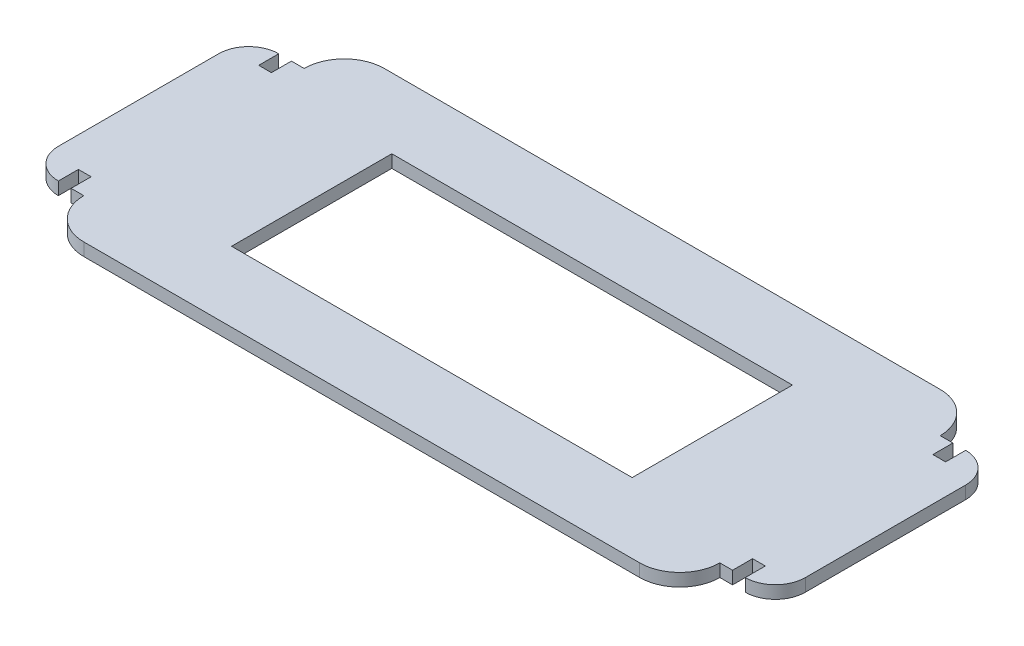
ISO-10303-21;
HEADER;
FILE_DESCRIPTION(('STEP AP214'),'2;1');
FILE_NAME('part.step','',(''),(''),'','','');
FILE_SCHEMA(('AUTOMOTIVE_DESIGN { 1 0 10303 214 1 1 1 1 }'));
ENDSEC;
DATA;
#1=APPLICATION_CONTEXT('core data for automotive mechanical design processes');
#2=APPLICATION_PROTOCOL_DEFINITION('international standard','automotive_design',2000,#1);
#3=PRODUCT_CONTEXT('',#1,'mechanical');
#4=PRODUCT('Part','Part','',(#3));
#5=PRODUCT_RELATED_PRODUCT_CATEGORY('part','',(#4));
#6=PRODUCT_DEFINITION_FORMATION('','',#4);
#7=PRODUCT_DEFINITION_CONTEXT('part definition',#1,'design');
#8=PRODUCT_DEFINITION('design','',#6,#7);
#9=PRODUCT_DEFINITION_SHAPE('','',#8);
#10=(LENGTH_UNIT() NAMED_UNIT(*) SI_UNIT(.MILLI.,.METRE.));
#11=(NAMED_UNIT(*) PLANE_ANGLE_UNIT() SI_UNIT($,.RADIAN.));
#12=(NAMED_UNIT(*) SI_UNIT($,.STERADIAN.) SOLID_ANGLE_UNIT());
#13=UNCERTAINTY_MEASURE_WITH_UNIT(LENGTH_MEASURE(1.E-05),#10,'distance_accuracy_value','');
#14=(GEOMETRIC_REPRESENTATION_CONTEXT(3) GLOBAL_UNCERTAINTY_ASSIGNED_CONTEXT((#13)) GLOBAL_UNIT_ASSIGNED_CONTEXT((#10,
#11,#12)) REPRESENTATION_CONTEXT('',''));
#15=CARTESIAN_POINT('',(0.,0.,0.));
#16=DIRECTION('',(0.,0.,1.));
#17=DIRECTION('',(1.,0.,0.));
#18=AXIS2_PLACEMENT_3D('',#15,#16,#17);
#19=CARTESIAN_POINT('',(82.55,3.175,-22.5));
#20=DIRECTION('',(0.,0.,-1.));
#21=DIRECTION('',(-1.,0.,0.));
#22=AXIS2_PLACEMENT_3D('',#19,#20,#21);
#23=PLANE('',#22);
#24=DIRECTION('',(1.,0.,0.));
#25=VECTOR('',#24,1.);
#26=CARTESIAN_POINT('',(82.55,0.,-22.5));
#27=LINE('',#26,#25);
#28=CARTESIAN_POINT('',(82.55,0.,-22.5));
#29=VERTEX_POINT('',#28);
#30=CARTESIAN_POINT('',(85.725,0.,-22.5));
#31=VERTEX_POINT('',#30);
#32=EDGE_CURVE('E372',#29,#31,#27,.T.);
#33=ORIENTED_EDGE('',*,*,#32,.F.);
#34=DIRECTION('',(0.,-1.,0.));
#35=VECTOR('',#34,1.);
#36=CARTESIAN_POINT('',(82.55,3.175,-22.5));
#37=LINE('',#36,#35);
#38=CARTESIAN_POINT('',(82.55,3.175,-22.5));
#39=VERTEX_POINT('',#38);
#40=EDGE_CURVE('E12',#39,#29,#37,.T.);
#41=ORIENTED_EDGE('',*,*,#40,.F.);
#42=DIRECTION('',(1.,0.,0.));
#43=VECTOR('',#42,1.);
#44=CARTESIAN_POINT('',(82.55,3.175,-22.5));
#45=LINE('',#44,#43);
#46=CARTESIAN_POINT('',(85.725,3.175,-22.5));
#47=VERTEX_POINT('',#46);
#48=EDGE_CURVE('E376',#39,#47,#45,.T.);
#49=ORIENTED_EDGE('',*,*,#48,.T.);
#50=DIRECTION('',(0.,-1.,0.));
#51=VECTOR('',#50,1.);
#52=CARTESIAN_POINT('',(85.725,3.175,-22.5));
#53=LINE('',#52,#51);
#54=EDGE_CURVE('E133',#47,#31,#53,.T.);
#55=ORIENTED_EDGE('',*,*,#54,.T.);
#56=EDGE_LOOP('',(#33,#41,#49,#55));
#57=FACE_BOUND('',#56,.T.);
#58=ADVANCED_FACE('F130',(#57),#23,.T.);
#59=CARTESIAN_POINT('',(82.55,3.175,-27.5));
#60=DIRECTION('',(1.,0.,0.));
#61=DIRECTION('',(0.,0.,-1.));
#62=AXIS2_PLACEMENT_3D('',#59,#60,#61);
#63=PLANE('',#62);
#64=DIRECTION('',(0.,0.,1.));
#65=VECTOR('',#64,1.);
#66=CARTESIAN_POINT('',(82.55,0.,-27.5));
#67=LINE('',#66,#65);
#68=CARTESIAN_POINT('',(82.55,0.,-27.5));
#69=VERTEX_POINT('',#68);
#70=EDGE_CURVE('E380',#69,#29,#67,.T.);
#71=ORIENTED_EDGE('',*,*,#70,.F.);
#72=DIRECTION('',(0.,-1.,0.));
#73=VECTOR('',#72,1.);
#74=CARTESIAN_POINT('',(82.55,3.175,-27.5));
#75=LINE('',#74,#73);
#76=CARTESIAN_POINT('',(82.55,3.175,-27.5));
#77=VERTEX_POINT('',#76);
#78=EDGE_CURVE('E138',#77,#69,#75,.T.);
#79=ORIENTED_EDGE('',*,*,#78,.F.);
#80=DIRECTION('',(0.,0.,1.));
#81=VECTOR('',#80,1.);
#82=CARTESIAN_POINT('',(82.55,3.175,-27.5));
#83=LINE('',#82,#81);
#84=EDGE_CURVE('E444',#77,#39,#83,.T.);
#85=ORIENTED_EDGE('',*,*,#84,.T.);
#86=ORIENTED_EDGE('',*,*,#40,.T.);
#87=EDGE_LOOP('',(#71,#79,#85,#86));
#88=FACE_BOUND('',#87,.T.);
#89=ADVANCED_FACE('F592',(#88),#63,.T.);
#90=CARTESIAN_POINT('',(79.375,3.175,-27.5));
#91=DIRECTION('',(0.,0.,-1.));
#92=DIRECTION('',(-1.,0.,0.));
#93=AXIS2_PLACEMENT_3D('',#90,#91,#92);
#94=PLANE('',#93);
#95=DIRECTION('',(1.,0.,0.));
#96=VECTOR('',#95,1.);
#97=CARTESIAN_POINT('',(79.375,0.,-27.5));
#98=LINE('',#97,#96);
#99=CARTESIAN_POINT('',(79.375,0.,-27.5));
#100=VERTEX_POINT('',#99);
#101=EDGE_CURVE('E514',#100,#69,#98,.T.);
#102=ORIENTED_EDGE('',*,*,#101,.F.);
#103=DIRECTION('',(0.,-1.,0.));
#104=VECTOR('',#103,1.);
#105=CARTESIAN_POINT('',(79.375,3.175,-27.5));
#106=LINE('',#105,#104);
#107=CARTESIAN_POINT('',(79.375,3.175,-27.5));
#108=VERTEX_POINT('',#107);
#109=EDGE_CURVE('E520',#108,#100,#106,.T.);
#110=ORIENTED_EDGE('',*,*,#109,.F.);
#111=DIRECTION('',(1.,0.,0.));
#112=VECTOR('',#111,1.);
#113=CARTESIAN_POINT('',(79.375,3.175,-27.5));
#114=LINE('',#113,#112);
#115=EDGE_CURVE('E441',#108,#77,#114,.T.);
#116=ORIENTED_EDGE('',*,*,#115,.T.);
#117=ORIENTED_EDGE('',*,*,#78,.T.);
#118=EDGE_LOOP('',(#102,#110,#116,#117));
#119=FACE_BOUND('',#118,.T.);
#120=ADVANCED_FACE('F701',(#119),#94,.T.);
#121=CARTESIAN_POINT('',(69.375,3.175,-27.5));
#122=DIRECTION('',(0.,-1.,0.));
#123=DIRECTION('',(0.,0.,-1.));
#124=AXIS2_PLACEMENT_3D('',#121,#122,#123);
#125=CYLINDRICAL_SURFACE('',#124,9.99999999999999);
#126=CARTESIAN_POINT('',(69.375,0.,-27.5));
#127=DIRECTION('',(0.,1.,0.));
#128=DIRECTION('',(0.,0.,1.));
#129=AXIS2_PLACEMENT_3D('',#126,#127,#128);
#130=CIRCLE('',#129,9.99999999999999);
#131=CARTESIAN_POINT('',(69.375,0.,-37.5));
#132=VERTEX_POINT('',#131);
#133=EDGE_CURVE('E511',#100,#132,#130,.T.);
#134=ORIENTED_EDGE('',*,*,#133,.T.);
#135=DIRECTION('',(0.,-1.,0.));
#136=VECTOR('',#135,1.);
#137=CARTESIAN_POINT('',(69.375,3.175,-37.5));
#138=LINE('',#137,#136);
#139=CARTESIAN_POINT('',(69.375,3.175,-37.5));
#140=VERTEX_POINT('',#139);
#141=EDGE_CURVE('E522',#140,#132,#138,.T.);
#142=ORIENTED_EDGE('',*,*,#141,.F.);
#143=CARTESIAN_POINT('',(69.375,3.175,-27.5));
#144=DIRECTION('',(0.,1.,0.));
#145=DIRECTION('',(0.,0.,1.));
#146=AXIS2_PLACEMENT_3D('',#143,#144,#145);
#147=CIRCLE('',#146,9.99999999999999);
#148=EDGE_CURVE('E439',#108,#140,#147,.T.);
#149=ORIENTED_EDGE('',*,*,#148,.F.);
#150=ORIENTED_EDGE('',*,*,#109,.T.);
#151=EDGE_LOOP('',(#134,#142,#149,#150));
#152=FACE_BOUND('',#151,.T.);
#153=ADVANCED_FACE('F703',(#152),#125,.T.);
#154=CARTESIAN_POINT('',(-69.375,3.175,-37.5));
#155=DIRECTION('',(0.,0.,-1.));
#156=DIRECTION('',(-1.,0.,0.));
#157=AXIS2_PLACEMENT_3D('',#154,#155,#156);
#158=PLANE('',#157);
#159=DIRECTION('',(1.,0.,0.));
#160=VECTOR('',#159,1.);
#161=CARTESIAN_POINT('',(-69.375,0.,-37.5));
#162=LINE('',#161,#160);
#163=CARTESIAN_POINT('',(-69.375,0.,-37.5));
#164=VERTEX_POINT('',#163);
#165=EDGE_CURVE('E508',#164,#132,#162,.T.);
#166=ORIENTED_EDGE('',*,*,#165,.F.);
#167=DIRECTION('',(0.,-1.,0.));
#168=VECTOR('',#167,1.);
#169=CARTESIAN_POINT('',(-69.375,3.175,-37.5));
#170=LINE('',#169,#168);
#171=CARTESIAN_POINT('',(-69.375,3.175,-37.5));
#172=VERTEX_POINT('',#171);
#173=EDGE_CURVE('E524',#172,#164,#170,.T.);
#174=ORIENTED_EDGE('',*,*,#173,.F.);
#175=DIRECTION('',(1.,0.,0.));
#176=VECTOR('',#175,1.);
#177=CARTESIAN_POINT('',(-69.375,3.175,-37.5));
#178=LINE('',#177,#176);
#179=EDGE_CURVE('E436',#172,#140,#178,.T.);
#180=ORIENTED_EDGE('',*,*,#179,.T.);
#181=ORIENTED_EDGE('',*,*,#141,.T.);
#182=EDGE_LOOP('',(#166,#174,#180,#181));
#183=FACE_BOUND('',#182,.T.);
#184=ADVANCED_FACE('F697',(#183),#158,.T.);
#185=CARTESIAN_POINT('',(-69.375,3.175,-27.5));
#186=DIRECTION('',(0.,-1.,0.));
#187=DIRECTION('',(0.,0.,-1.));
#188=AXIS2_PLACEMENT_3D('',#185,#186,#187);
#189=CYLINDRICAL_SURFACE('',#188,9.99999999999999);
#190=CARTESIAN_POINT('',(-69.375,0.,-27.5));
#191=DIRECTION('',(0.,-1.,0.));
#192=DIRECTION('',(0.,0.,-1.));
#193=AXIS2_PLACEMENT_3D('',#190,#191,#192);
#194=CIRCLE('',#193,9.99999999999999);
#195=CARTESIAN_POINT('',(-79.375,0.,-27.5));
#196=VERTEX_POINT('',#195);
#197=EDGE_CURVE('E505',#196,#164,#194,.T.);
#198=ORIENTED_EDGE('',*,*,#197,.F.);
#199=DIRECTION('',(0.,-1.,0.));
#200=VECTOR('',#199,1.);
#201=CARTESIAN_POINT('',(-79.375,3.175,-27.5));
#202=LINE('',#201,#200);
#203=CARTESIAN_POINT('',(-79.375,3.175,-27.5));
#204=VERTEX_POINT('',#203);
#205=EDGE_CURVE('E526',#204,#196,#202,.T.);
#206=ORIENTED_EDGE('',*,*,#205,.F.);
#207=CARTESIAN_POINT('',(-69.375,3.175,-27.5));
#208=DIRECTION('',(0.,-1.,0.));
#209=DIRECTION('',(0.,0.,-1.));
#210=AXIS2_PLACEMENT_3D('',#207,#208,#209);
#211=CIRCLE('',#210,9.99999999999999);
#212=EDGE_CURVE('E433',#204,#172,#211,.T.);
#213=ORIENTED_EDGE('',*,*,#212,.T.);
#214=ORIENTED_EDGE('',*,*,#173,.T.);
#215=EDGE_LOOP('',(#198,#206,#213,#214));
#216=FACE_BOUND('',#215,.T.);
#217=ADVANCED_FACE('F693',(#216),#189,.T.);
#218=CARTESIAN_POINT('',(-79.375,3.175,-27.5));
#219=DIRECTION('',(0.,0.,1.));
#220=DIRECTION('',(1.,0.,0.));
#221=AXIS2_PLACEMENT_3D('',#218,#219,#220);
#222=PLANE('',#221);
#223=DIRECTION('',(-1.,0.,0.));
#224=VECTOR('',#223,1.);
#225=CARTESIAN_POINT('',(-79.375,0.,-27.5));
#226=LINE('',#225,#224);
#227=CARTESIAN_POINT('',(-82.55,0.,-27.5));
#228=VERTEX_POINT('',#227);
#229=EDGE_CURVE('E503',#196,#228,#226,.T.);
#230=ORIENTED_EDGE('',*,*,#229,.T.);
#231=DIRECTION('',(0.,-1.,0.));
#232=VECTOR('',#231,1.);
#233=CARTESIAN_POINT('',(-82.55,3.175,-27.5));
#234=LINE('',#233,#232);
#235=CARTESIAN_POINT('',(-82.55,3.175,-27.5));
#236=VERTEX_POINT('',#235);
#237=EDGE_CURVE('E528',#236,#228,#234,.T.);
#238=ORIENTED_EDGE('',*,*,#237,.F.);
#239=DIRECTION('',(-1.,0.,0.));
#240=VECTOR('',#239,1.);
#241=CARTESIAN_POINT('',(-79.375,3.175,-27.5));
#242=LINE('',#241,#240);
#243=EDGE_CURVE('E431',#204,#236,#242,.T.);
#244=ORIENTED_EDGE('',*,*,#243,.F.);
#245=ORIENTED_EDGE('',*,*,#205,.T.);
#246=EDGE_LOOP('',(#230,#238,#244,#245));
#247=FACE_BOUND('',#246,.T.);
#248=ADVANCED_FACE('F689',(#247),#222,.F.);
#249=CARTESIAN_POINT('',(-82.55,3.175,-27.5));
#250=DIRECTION('',(1.,0.,0.));
#251=DIRECTION('',(0.,0.,-1.));
#252=AXIS2_PLACEMENT_3D('',#249,#250,#251);
#253=PLANE('',#252);
#254=DIRECTION('',(0.,0.,1.));
#255=VECTOR('',#254,1.);
#256=CARTESIAN_POINT('',(-82.55,0.,-27.5));
#257=LINE('',#256,#255);
#258=CARTESIAN_POINT('',(-82.55,0.,-22.5));
#259=VERTEX_POINT('',#258);
#260=EDGE_CURVE('E501',#228,#259,#257,.T.);
#261=ORIENTED_EDGE('',*,*,#260,.T.);
#262=DIRECTION('',(0.,-1.,0.));
#263=VECTOR('',#262,1.);
#264=CARTESIAN_POINT('',(-82.55,3.175,-22.5));
#265=LINE('',#264,#263);
#266=CARTESIAN_POINT('',(-82.55,3.175,-22.5));
#267=VERTEX_POINT('',#266);
#268=EDGE_CURVE('E531',#267,#259,#265,.T.);
#269=ORIENTED_EDGE('',*,*,#268,.F.);
#270=DIRECTION('',(0.,0.,1.));
#271=VECTOR('',#270,1.);
#272=CARTESIAN_POINT('',(-82.55,3.175,-27.5));
#273=LINE('',#272,#271);
#274=EDGE_CURVE('E429',#236,#267,#273,.T.);
#275=ORIENTED_EDGE('',*,*,#274,.F.);
#276=ORIENTED_EDGE('',*,*,#237,.T.);
#277=EDGE_LOOP('',(#261,#269,#275,#276));
#278=FACE_BOUND('',#277,.T.);
#279=ADVANCED_FACE('F685',(#278),#253,.F.);
#280=CARTESIAN_POINT('',(-82.55,3.175,-22.5));
#281=DIRECTION('',(0.,0.,1.));
#282=DIRECTION('',(1.,0.,0.));
#283=AXIS2_PLACEMENT_3D('',#280,#281,#282);
#284=PLANE('',#283);
#285=DIRECTION('',(-1.,0.,0.));
#286=VECTOR('',#285,1.);
#287=CARTESIAN_POINT('',(-82.55,0.,-22.5));
#288=LINE('',#287,#286);
#289=CARTESIAN_POINT('',(-85.725,0.,-22.5));
#290=VERTEX_POINT('',#289);
#291=EDGE_CURVE('E499',#259,#290,#288,.T.);
#292=ORIENTED_EDGE('',*,*,#291,.T.);
#293=DIRECTION('',(0.,-1.,0.));
#294=VECTOR('',#293,1.);
#295=CARTESIAN_POINT('',(-85.725,3.175,-22.5));
#296=LINE('',#295,#294);
#297=CARTESIAN_POINT('',(-85.725,3.175,-22.5));
#298=VERTEX_POINT('',#297);
#299=EDGE_CURVE('E534',#298,#290,#296,.T.);
#300=ORIENTED_EDGE('',*,*,#299,.F.);
#301=DIRECTION('',(-1.,0.,0.));
#302=VECTOR('',#301,1.);
#303=CARTESIAN_POINT('',(-82.55,3.175,-22.5));
#304=LINE('',#303,#302);
#305=EDGE_CURVE('E427',#267,#298,#304,.T.);
#306=ORIENTED_EDGE('',*,*,#305,.F.);
#307=ORIENTED_EDGE('',*,*,#268,.T.);
#308=EDGE_LOOP('',(#292,#300,#306,#307));
#309=FACE_BOUND('',#308,.T.);
#310=ADVANCED_FACE('F680',(#309),#284,.F.);
#311=CARTESIAN_POINT('',(-85.725,3.175,-22.5));
#312=DIRECTION('',(-1.,0.,0.));
#313=DIRECTION('',(0.,0.,1.));
#314=AXIS2_PLACEMENT_3D('',#311,#312,#313);
#315=PLANE('',#314);
#316=DIRECTION('',(0.,0.,-1.));
#317=VECTOR('',#316,1.);
#318=CARTESIAN_POINT('',(-85.725,0.,-22.5));
#319=LINE('',#318,#317);
#320=CARTESIAN_POINT('',(-85.725,0.,-27.5));
#321=VERTEX_POINT('',#320);
#322=EDGE_CURVE('E497',#290,#321,#319,.T.);
#323=ORIENTED_EDGE('',*,*,#322,.T.);
#324=DIRECTION('',(0.,-1.,0.));
#325=VECTOR('',#324,1.);
#326=CARTESIAN_POINT('',(-85.725,3.175,-27.5));
#327=LINE('',#326,#325);
#328=CARTESIAN_POINT('',(-85.725,3.175,-27.5));
#329=VERTEX_POINT('',#328);
#330=EDGE_CURVE('E537',#329,#321,#327,.T.);
#331=ORIENTED_EDGE('',*,*,#330,.F.);
#332=DIRECTION('',(0.,0.,-1.));
#333=VECTOR('',#332,1.);
#334=CARTESIAN_POINT('',(-85.725,3.175,-22.5));
#335=LINE('',#334,#333);
#336=EDGE_CURVE('E425',#298,#329,#335,.T.);
#337=ORIENTED_EDGE('',*,*,#336,.F.);
#338=ORIENTED_EDGE('',*,*,#299,.T.);
#339=EDGE_LOOP('',(#323,#331,#337,#338));
#340=FACE_BOUND('',#339,.T.);
#341=ADVANCED_FACE('F674',(#340),#315,.F.);
#342=CARTESIAN_POINT('',(-85.725,3.175,-20.));
#343=DIRECTION('',(0.,-1.,0.));
#344=DIRECTION('',(0.,0.,-1.));
#345=AXIS2_PLACEMENT_3D('',#342,#343,#344);
#346=CYLINDRICAL_SURFACE('',#345,7.5);
#347=CARTESIAN_POINT('',(-85.725,0.,-20.));
#348=DIRECTION('',(0.,1.,0.));
#349=DIRECTION('',(0.,0.,1.));
#350=AXIS2_PLACEMENT_3D('',#347,#348,#349);
#351=CIRCLE('',#350,7.5);
#352=CARTESIAN_POINT('',(-93.225,0.,-20.));
#353=VERTEX_POINT('',#352);
#354=EDGE_CURVE('E494',#321,#353,#351,.T.);
#355=ORIENTED_EDGE('',*,*,#354,.T.);
#356=DIRECTION('',(0.,-1.,0.));
#357=VECTOR('',#356,1.);
#358=CARTESIAN_POINT('',(-93.225,3.175,-20.));
#359=LINE('',#358,#357);
#360=CARTESIAN_POINT('',(-93.225,3.175,-20.));
#361=VERTEX_POINT('',#360);
#362=EDGE_CURVE('E540',#361,#353,#359,.T.);
#363=ORIENTED_EDGE('',*,*,#362,.F.);
#364=CARTESIAN_POINT('',(-85.725,3.175,-20.));
#365=DIRECTION('',(0.,1.,0.));
#366=DIRECTION('',(0.,0.,1.));
#367=AXIS2_PLACEMENT_3D('',#364,#365,#366);
#368=CIRCLE('',#367,7.5);
#369=EDGE_CURVE('E423',#329,#361,#368,.T.);
#370=ORIENTED_EDGE('',*,*,#369,.F.);
#371=ORIENTED_EDGE('',*,*,#330,.T.);
#372=EDGE_LOOP('',(#355,#363,#370,#371));
#373=FACE_BOUND('',#372,.T.);
#374=ADVANCED_FACE('F670',(#373),#346,.T.);
#375=CARTESIAN_POINT('',(-93.225,3.175,20.));
#376=DIRECTION('',(-1.,0.,0.));
#377=DIRECTION('',(0.,0.,1.));
#378=AXIS2_PLACEMENT_3D('',#375,#376,#377);
#379=PLANE('',#378);
#380=DIRECTION('',(0.,0.,-1.));
#381=VECTOR('',#380,1.);
#382=CARTESIAN_POINT('',(-93.225,0.,20.));
#383=LINE('',#382,#381);
#384=CARTESIAN_POINT('',(-93.225,0.,20.));
#385=VERTEX_POINT('',#384);
#386=EDGE_CURVE('E491',#385,#353,#383,.T.);
#387=ORIENTED_EDGE('',*,*,#386,.F.);
#388=DIRECTION('',(0.,-1.,0.));
#389=VECTOR('',#388,1.);
#390=CARTESIAN_POINT('',(-93.225,3.175,20.));
#391=LINE('',#390,#389);
#392=CARTESIAN_POINT('',(-93.225,3.175,20.));
#393=VERTEX_POINT('',#392);
#394=EDGE_CURVE('E542',#393,#385,#391,.T.);
#395=ORIENTED_EDGE('',*,*,#394,.F.);
#396=DIRECTION('',(0.,0.,-1.));
#397=VECTOR('',#396,1.);
#398=CARTESIAN_POINT('',(-93.225,3.175,20.));
#399=LINE('',#398,#397);
#400=EDGE_CURVE('E420',#393,#361,#399,.T.);
#401=ORIENTED_EDGE('',*,*,#400,.T.);
#402=ORIENTED_EDGE('',*,*,#362,.T.);
#403=EDGE_LOOP('',(#387,#395,#401,#402));
#404=FACE_BOUND('',#403,.T.);
#405=ADVANCED_FACE('F665',(#404),#379,.T.);
#406=CARTESIAN_POINT('',(-85.725,3.175,20.));
#407=DIRECTION('',(0.,-1.,0.));
#408=DIRECTION('',(0.,0.,-1.));
#409=AXIS2_PLACEMENT_3D('',#406,#407,#408);
#410=CYLINDRICAL_SURFACE('',#409,7.5);
#411=CARTESIAN_POINT('',(-85.725,0.,20.));
#412=DIRECTION('',(0.,-1.,0.));
#413=DIRECTION('',(0.,0.,-1.));
#414=AXIS2_PLACEMENT_3D('',#411,#412,#413);
#415=CIRCLE('',#414,7.5);
#416=CARTESIAN_POINT('',(-85.725,0.,27.5));
#417=VERTEX_POINT('',#416);
#418=EDGE_CURVE('E488',#417,#385,#415,.T.);
#419=ORIENTED_EDGE('',*,*,#418,.F.);
#420=DIRECTION('',(0.,-1.,0.));
#421=VECTOR('',#420,1.);
#422=CARTESIAN_POINT('',(-85.725,3.175,27.5));
#423=LINE('',#422,#421);
#424=CARTESIAN_POINT('',(-85.725,3.175,27.5));
#425=VERTEX_POINT('',#424);
#426=EDGE_CURVE('E544',#425,#417,#423,.T.);
#427=ORIENTED_EDGE('',*,*,#426,.F.);
#428=CARTESIAN_POINT('',(-85.725,3.175,20.));
#429=DIRECTION('',(0.,-1.,0.));
#430=DIRECTION('',(0.,0.,-1.));
#431=AXIS2_PLACEMENT_3D('',#428,#429,#430);
#432=CIRCLE('',#431,7.5);
#433=EDGE_CURVE('E417',#425,#393,#432,.T.);
#434=ORIENTED_EDGE('',*,*,#433,.T.);
#435=ORIENTED_EDGE('',*,*,#394,.T.);
#436=EDGE_LOOP('',(#419,#427,#434,#435));
#437=FACE_BOUND('',#436,.T.);
#438=ADVANCED_FACE('F660',(#437),#410,.T.);
#439=CARTESIAN_POINT('',(-85.725,3.175,22.5));
#440=DIRECTION('',(1.,0.,0.));
#441=DIRECTION('',(0.,0.,-1.));
#442=AXIS2_PLACEMENT_3D('',#439,#440,#441);
#443=PLANE('',#442);
#444=DIRECTION('',(0.,0.,1.));
#445=VECTOR('',#444,1.);
#446=CARTESIAN_POINT('',(-85.725,0.,22.5));
#447=LINE('',#446,#445);
#448=CARTESIAN_POINT('',(-85.725,0.,22.5));
#449=VERTEX_POINT('',#448);
#450=EDGE_CURVE('E485',#449,#417,#447,.T.);
#451=ORIENTED_EDGE('',*,*,#450,.F.);
#452=DIRECTION('',(0.,-1.,0.));
#453=VECTOR('',#452,1.);
#454=CARTESIAN_POINT('',(-85.725,3.175,22.5));
#455=LINE('',#454,#453);
#456=CARTESIAN_POINT('',(-85.725,3.175,22.5));
#457=VERTEX_POINT('',#456);
#458=EDGE_CURVE('E546',#457,#449,#455,.T.);
#459=ORIENTED_EDGE('',*,*,#458,.F.);
#460=DIRECTION('',(0.,0.,1.));
#461=VECTOR('',#460,1.);
#462=CARTESIAN_POINT('',(-85.725,3.175,22.5));
#463=LINE('',#462,#461);
#464=EDGE_CURVE('E414',#457,#425,#463,.T.);
#465=ORIENTED_EDGE('',*,*,#464,.T.);
#466=ORIENTED_EDGE('',*,*,#426,.T.);
#467=EDGE_LOOP('',(#451,#459,#465,#466));
#468=FACE_BOUND('',#467,.T.);
#469=ADVANCED_FACE('F656',(#468),#443,.T.);
#470=CARTESIAN_POINT('',(-82.55,3.175,22.5));
#471=DIRECTION('',(0.,0.,1.));
#472=DIRECTION('',(1.,0.,0.));
#473=AXIS2_PLACEMENT_3D('',#470,#471,#472);
#474=PLANE('',#473);
#475=DIRECTION('',(-1.,0.,0.));
#476=VECTOR('',#475,1.);
#477=CARTESIAN_POINT('',(-82.55,0.,22.5));
#478=LINE('',#477,#476);
#479=CARTESIAN_POINT('',(-82.55,0.,22.5));
#480=VERTEX_POINT('',#479);
#481=EDGE_CURVE('E482',#480,#449,#478,.T.);
#482=ORIENTED_EDGE('',*,*,#481,.F.);
#483=DIRECTION('',(0.,-1.,0.));
#484=VECTOR('',#483,1.);
#485=CARTESIAN_POINT('',(-82.55,3.175,22.5));
#486=LINE('',#485,#484);
#487=CARTESIAN_POINT('',(-82.55,3.175,22.5));
#488=VERTEX_POINT('',#487);
#489=EDGE_CURVE('E548',#488,#480,#486,.T.);
#490=ORIENTED_EDGE('',*,*,#489,.F.);
#491=DIRECTION('',(-1.,0.,0.));
#492=VECTOR('',#491,1.);
#493=CARTESIAN_POINT('',(-82.55,3.175,22.5));
#494=LINE('',#493,#492);
#495=EDGE_CURVE('E411',#488,#457,#494,.T.);
#496=ORIENTED_EDGE('',*,*,#495,.T.);
#497=ORIENTED_EDGE('',*,*,#458,.T.);
#498=EDGE_LOOP('',(#482,#490,#496,#497));
#499=FACE_BOUND('',#498,.T.);
#500=ADVANCED_FACE('F652',(#499),#474,.T.);
#501=CARTESIAN_POINT('',(-82.55,3.175,27.5));
#502=DIRECTION('',(-1.,0.,0.));
#503=DIRECTION('',(0.,0.,1.));
#504=AXIS2_PLACEMENT_3D('',#501,#502,#503);
#505=PLANE('',#504);
#506=DIRECTION('',(0.,0.,-1.));
#507=VECTOR('',#506,1.);
#508=CARTESIAN_POINT('',(-82.55,0.,27.5));
#509=LINE('',#508,#507);
#510=CARTESIAN_POINT('',(-82.55,0.,27.5));
#511=VERTEX_POINT('',#510);
#512=EDGE_CURVE('E479',#511,#480,#509,.T.);
#513=ORIENTED_EDGE('',*,*,#512,.F.);
#514=DIRECTION('',(0.,-1.,0.));
#515=VECTOR('',#514,1.);
#516=CARTESIAN_POINT('',(-82.55,3.175,27.5));
#517=LINE('',#516,#515);
#518=CARTESIAN_POINT('',(-82.55,3.175,27.5));
#519=VERTEX_POINT('',#518);
#520=EDGE_CURVE('E550',#519,#511,#517,.T.);
#521=ORIENTED_EDGE('',*,*,#520,.F.);
#522=DIRECTION('',(0.,0.,-1.));
#523=VECTOR('',#522,1.);
#524=CARTESIAN_POINT('',(-82.55,3.175,27.5));
#525=LINE('',#524,#523);
#526=EDGE_CURVE('E408',#519,#488,#525,.T.);
#527=ORIENTED_EDGE('',*,*,#526,.T.);
#528=ORIENTED_EDGE('',*,*,#489,.T.);
#529=EDGE_LOOP('',(#513,#521,#527,#528));
#530=FACE_BOUND('',#529,.T.);
#531=ADVANCED_FACE('F648',(#530),#505,.T.);
#532=CARTESIAN_POINT('',(-79.375,3.175,27.5));
#533=DIRECTION('',(0.,0.,1.));
#534=DIRECTION('',(1.,0.,0.));
#535=AXIS2_PLACEMENT_3D('',#532,#533,#534);
#536=PLANE('',#535);
#537=DIRECTION('',(-1.,0.,0.));
#538=VECTOR('',#537,1.);
#539=CARTESIAN_POINT('',(-79.375,0.,27.5));
#540=LINE('',#539,#538);
#541=CARTESIAN_POINT('',(-79.375,0.,27.5));
#542=VERTEX_POINT('',#541);
#543=EDGE_CURVE('E476',#542,#511,#540,.T.);
#544=ORIENTED_EDGE('',*,*,#543,.F.);
#545=DIRECTION('',(0.,-1.,0.));
#546=VECTOR('',#545,1.);
#547=CARTESIAN_POINT('',(-79.375,3.175,27.5));
#548=LINE('',#547,#546);
#549=CARTESIAN_POINT('',(-79.375,3.175,27.5));
#550=VERTEX_POINT('',#549);
#551=EDGE_CURVE('E552',#550,#542,#548,.T.);
#552=ORIENTED_EDGE('',*,*,#551,.F.);
#553=DIRECTION('',(-1.,0.,0.));
#554=VECTOR('',#553,1.);
#555=CARTESIAN_POINT('',(-79.375,3.175,27.5));
#556=LINE('',#555,#554);
#557=EDGE_CURVE('E405',#550,#519,#556,.T.);
#558=ORIENTED_EDGE('',*,*,#557,.T.);
#559=ORIENTED_EDGE('',*,*,#520,.T.);
#560=EDGE_LOOP('',(#544,#552,#558,#559));
#561=FACE_BOUND('',#560,.T.);
#562=ADVANCED_FACE('F642',(#561),#536,.T.);
#563=CARTESIAN_POINT('',(-69.375,3.175,27.5));
#564=DIRECTION('',(0.,-1.,0.));
#565=DIRECTION('',(0.,0.,-1.));
#566=AXIS2_PLACEMENT_3D('',#563,#564,#565);
#567=CYLINDRICAL_SURFACE('',#566,9.99999999999999);
#568=CARTESIAN_POINT('',(-69.375,0.,27.5));
#569=DIRECTION('',(0.,1.,0.));
#570=DIRECTION('',(0.,0.,1.));
#571=AXIS2_PLACEMENT_3D('',#568,#569,#570);
#572=CIRCLE('',#571,9.99999999999999);
#573=CARTESIAN_POINT('',(-69.375,0.,37.5));
#574=VERTEX_POINT('',#573);
#575=EDGE_CURVE('E474',#542,#574,#572,.T.);
#576=ORIENTED_EDGE('',*,*,#575,.T.);
#577=DIRECTION('',(0.,-1.,0.));
#578=VECTOR('',#577,1.);
#579=CARTESIAN_POINT('',(-69.375,3.175,37.5));
#580=LINE('',#579,#578);
#581=CARTESIAN_POINT('',(-69.375,3.175,37.5));
#582=VERTEX_POINT('',#581);
#583=EDGE_CURVE('E554',#582,#574,#580,.T.);
#584=ORIENTED_EDGE('',*,*,#583,.F.);
#585=CARTESIAN_POINT('',(-69.375,3.175,27.5));
#586=DIRECTION('',(0.,1.,0.));
#587=DIRECTION('',(0.,0.,1.));
#588=AXIS2_PLACEMENT_3D('',#585,#586,#587);
#589=CIRCLE('',#588,9.99999999999999);
#590=EDGE_CURVE('E403',#550,#582,#589,.T.);
#591=ORIENTED_EDGE('',*,*,#590,.F.);
#592=ORIENTED_EDGE('',*,*,#551,.T.);
#593=EDGE_LOOP('',(#576,#584,#591,#592));
#594=FACE_BOUND('',#593,.T.);
#595=ADVANCED_FACE('F839',(#594),#567,.T.);
#596=CARTESIAN_POINT('',(-69.375,3.175,37.5));
#597=DIRECTION('',(0.,0.,-1.));
#598=DIRECTION('',(-1.,0.,0.));
#599=AXIS2_PLACEMENT_3D('',#596,#597,#598);
#600=PLANE('',#599);
#601=DIRECTION('',(1.,0.,0.));
#602=VECTOR('',#601,1.);
#603=CARTESIAN_POINT('',(-69.375,0.,37.5));
#604=LINE('',#603,#602);
#605=CARTESIAN_POINT('',(69.375,0.,37.5));
#606=VERTEX_POINT('',#605);
#607=EDGE_CURVE('E471',#574,#606,#604,.T.);
#608=ORIENTED_EDGE('',*,*,#607,.T.);
#609=DIRECTION('',(0.,-1.,0.));
#610=VECTOR('',#609,1.);
#611=CARTESIAN_POINT('',(69.375,3.175,37.5));
#612=LINE('',#611,#610);
#613=CARTESIAN_POINT('',(69.375,3.175,37.5));
#614=VERTEX_POINT('',#613);
#615=EDGE_CURVE('E557',#614,#606,#612,.T.);
#616=ORIENTED_EDGE('',*,*,#615,.F.);
#617=DIRECTION('',(1.,0.,0.));
#618=VECTOR('',#617,1.);
#619=CARTESIAN_POINT('',(-69.375,3.175,37.5));
#620=LINE('',#619,#618);
#621=EDGE_CURVE('E401',#582,#614,#620,.T.);
#622=ORIENTED_EDGE('',*,*,#621,.F.);
#623=ORIENTED_EDGE('',*,*,#583,.T.);
#624=EDGE_LOOP('',(#608,#616,#622,#623));
#625=FACE_BOUND('',#624,.T.);
#626=ADVANCED_FACE('F636',(#625),#600,.F.);
#627=CARTESIAN_POINT('',(69.375,3.175,27.5));
#628=DIRECTION('',(0.,-1.,0.));
#629=DIRECTION('',(0.,0.,-1.));
#630=AXIS2_PLACEMENT_3D('',#627,#628,#629);
#631=CYLINDRICAL_SURFACE('',#630,9.99999999999999);
#632=CARTESIAN_POINT('',(69.375,0.,27.5));
#633=DIRECTION('',(0.,-1.,0.));
#634=DIRECTION('',(0.,0.,-1.));
#635=AXIS2_PLACEMENT_3D('',#632,#633,#634);
#636=CIRCLE('',#635,9.99999999999999);
#637=CARTESIAN_POINT('',(79.375,0.,27.5));
#638=VERTEX_POINT('',#637);
#639=EDGE_CURVE('E468',#638,#606,#636,.T.);
#640=ORIENTED_EDGE('',*,*,#639,.F.);
#641=DIRECTION('',(0.,-1.,0.));
#642=VECTOR('',#641,1.);
#643=CARTESIAN_POINT('',(79.375,3.175,27.5));
#644=LINE('',#643,#642);
#645=CARTESIAN_POINT('',(79.375,3.175,27.5));
#646=VERTEX_POINT('',#645);
#647=EDGE_CURVE('E559',#646,#638,#644,.T.);
#648=ORIENTED_EDGE('',*,*,#647,.F.);
#649=CARTESIAN_POINT('',(69.375,3.175,27.5));
#650=DIRECTION('',(0.,-1.,0.));
#651=DIRECTION('',(0.,0.,-1.));
#652=AXIS2_PLACEMENT_3D('',#649,#650,#651);
#653=CIRCLE('',#652,9.99999999999999);
#654=EDGE_CURVE('E398',#646,#614,#653,.T.);
#655=ORIENTED_EDGE('',*,*,#654,.T.);
#656=ORIENTED_EDGE('',*,*,#615,.T.);
#657=EDGE_LOOP('',(#640,#648,#655,#656));
#658=FACE_BOUND('',#657,.T.);
#659=ADVANCED_FACE('F632',(#658),#631,.T.);
#660=CARTESIAN_POINT('',(79.375,3.175,27.5));
#661=DIRECTION('',(0.,0.,-1.));
#662=DIRECTION('',(-1.,0.,0.));
#663=AXIS2_PLACEMENT_3D('',#660,#661,#662);
#664=PLANE('',#663);
#665=DIRECTION('',(1.,0.,0.));
#666=VECTOR('',#665,1.);
#667=CARTESIAN_POINT('',(79.375,0.,27.5));
#668=LINE('',#667,#666);
#669=CARTESIAN_POINT('',(82.55,0.,27.5));
#670=VERTEX_POINT('',#669);
#671=EDGE_CURVE('E466',#638,#670,#668,.T.);
#672=ORIENTED_EDGE('',*,*,#671,.T.);
#673=DIRECTION('',(0.,-1.,0.));
#674=VECTOR('',#673,1.);
#675=CARTESIAN_POINT('',(82.55,3.175,27.5));
#676=LINE('',#675,#674);
#677=CARTESIAN_POINT('',(82.55,3.175,27.5));
#678=VERTEX_POINT('',#677);
#679=EDGE_CURVE('E561',#678,#670,#676,.T.);
#680=ORIENTED_EDGE('',*,*,#679,.F.);
#681=DIRECTION('',(1.,0.,0.));
#682=VECTOR('',#681,1.);
#683=CARTESIAN_POINT('',(79.375,3.175,27.5));
#684=LINE('',#683,#682);
#685=EDGE_CURVE('E396',#646,#678,#684,.T.);
#686=ORIENTED_EDGE('',*,*,#685,.F.);
#687=ORIENTED_EDGE('',*,*,#647,.T.);
#688=EDGE_LOOP('',(#672,#680,#686,#687));
#689=FACE_BOUND('',#688,.T.);
#690=ADVANCED_FACE('F627',(#689),#664,.F.);
#691=CARTESIAN_POINT('',(82.55,3.175,27.5));
#692=DIRECTION('',(-1.,0.,0.));
#693=DIRECTION('',(0.,0.,1.));
#694=AXIS2_PLACEMENT_3D('',#691,#692,#693);
#695=PLANE('',#694);
#696=DIRECTION('',(0.,0.,-1.));
#697=VECTOR('',#696,1.);
#698=CARTESIAN_POINT('',(82.55,0.,27.5));
#699=LINE('',#698,#697);
#700=CARTESIAN_POINT('',(82.55,0.,22.5));
#701=VERTEX_POINT('',#700);
#702=EDGE_CURVE('E464',#670,#701,#699,.T.);
#703=ORIENTED_EDGE('',*,*,#702,.T.);
#704=DIRECTION('',(0.,-1.,0.));
#705=VECTOR('',#704,1.);
#706=CARTESIAN_POINT('',(82.55,3.175,22.5));
#707=LINE('',#706,#705);
#708=CARTESIAN_POINT('',(82.55,3.175,22.5));
#709=VERTEX_POINT('',#708);
#710=EDGE_CURVE('E564',#709,#701,#707,.T.);
#711=ORIENTED_EDGE('',*,*,#710,.F.);
#712=DIRECTION('',(0.,0.,-1.));
#713=VECTOR('',#712,1.);
#714=CARTESIAN_POINT('',(82.55,3.175,27.5));
#715=LINE('',#714,#713);
#716=EDGE_CURVE('E394',#678,#709,#715,.T.);
#717=ORIENTED_EDGE('',*,*,#716,.F.);
#718=ORIENTED_EDGE('',*,*,#679,.T.);
#719=EDGE_LOOP('',(#703,#711,#717,#718));
#720=FACE_BOUND('',#719,.T.);
#721=ADVANCED_FACE('F623',(#720),#695,.F.);
#722=CARTESIAN_POINT('',(82.55,3.175,22.5));
#723=DIRECTION('',(0.,0.,-1.));
#724=DIRECTION('',(-1.,0.,0.));
#725=AXIS2_PLACEMENT_3D('',#722,#723,#724);
#726=PLANE('',#725);
#727=DIRECTION('',(1.,0.,0.));
#728=VECTOR('',#727,1.);
#729=CARTESIAN_POINT('',(82.55,0.,22.5));
#730=LINE('',#729,#728);
#731=CARTESIAN_POINT('',(85.725,0.,22.5));
#732=VERTEX_POINT('',#731);
#733=EDGE_CURVE('E462',#701,#732,#730,.T.);
#734=ORIENTED_EDGE('',*,*,#733,.T.);
#735=DIRECTION('',(0.,-1.,0.));
#736=VECTOR('',#735,1.);
#737=CARTESIAN_POINT('',(85.725,3.175,22.5));
#738=LINE('',#737,#736);
#739=CARTESIAN_POINT('',(85.725,3.175,22.5));
#740=VERTEX_POINT('',#739);
#741=EDGE_CURVE('E567',#740,#732,#738,.T.);
#742=ORIENTED_EDGE('',*,*,#741,.F.);
#743=DIRECTION('',(1.,0.,0.));
#744=VECTOR('',#743,1.);
#745=CARTESIAN_POINT('',(82.55,3.175,22.5));
#746=LINE('',#745,#744);
#747=EDGE_CURVE('E392',#709,#740,#746,.T.);
#748=ORIENTED_EDGE('',*,*,#747,.F.);
#749=ORIENTED_EDGE('',*,*,#710,.T.);
#750=EDGE_LOOP('',(#734,#742,#748,#749));
#751=FACE_BOUND('',#750,.T.);
#752=ADVANCED_FACE('F618',(#751),#726,.F.);
#753=CARTESIAN_POINT('',(85.725,3.175,22.5));
#754=DIRECTION('',(1.,0.,0.));
#755=DIRECTION('',(0.,0.,-1.));
#756=AXIS2_PLACEMENT_3D('',#753,#754,#755);
#757=PLANE('',#756);
#758=DIRECTION('',(0.,0.,1.));
#759=VECTOR('',#758,1.);
#760=CARTESIAN_POINT('',(85.725,0.,22.5));
#761=LINE('',#760,#759);
#762=CARTESIAN_POINT('',(85.725,0.,27.5));
#763=VERTEX_POINT('',#762);
#764=EDGE_CURVE('E460',#732,#763,#761,.T.);
#765=ORIENTED_EDGE('',*,*,#764,.T.);
#766=DIRECTION('',(0.,-1.,0.));
#767=VECTOR('',#766,1.);
#768=CARTESIAN_POINT('',(85.725,3.175,27.5));
#769=LINE('',#768,#767);
#770=CARTESIAN_POINT('',(85.725,3.175,27.5));
#771=VERTEX_POINT('',#770);
#772=EDGE_CURVE('E570',#771,#763,#769,.T.);
#773=ORIENTED_EDGE('',*,*,#772,.F.);
#774=DIRECTION('',(0.,0.,1.));
#775=VECTOR('',#774,1.);
#776=CARTESIAN_POINT('',(85.725,3.175,22.5));
#777=LINE('',#776,#775);
#778=EDGE_CURVE('E390',#740,#771,#777,.T.);
#779=ORIENTED_EDGE('',*,*,#778,.F.);
#780=ORIENTED_EDGE('',*,*,#741,.T.);
#781=EDGE_LOOP('',(#765,#773,#779,#780));
#782=FACE_BOUND('',#781,.T.);
#783=ADVANCED_FACE('F612',(#782),#757,.F.);
#784=CARTESIAN_POINT('',(85.725,3.175,20.));
#785=DIRECTION('',(0.,-1.,0.));
#786=DIRECTION('',(0.,0.,-1.));
#787=AXIS2_PLACEMENT_3D('',#784,#785,#786);
#788=CYLINDRICAL_SURFACE('',#787,7.5);
#789=CARTESIAN_POINT('',(85.725,0.,20.));
#790=DIRECTION('',(0.,1.,0.));
#791=DIRECTION('',(0.,0.,1.));
#792=AXIS2_PLACEMENT_3D('',#789,#790,#791);
#793=CIRCLE('',#792,7.5);
#794=CARTESIAN_POINT('',(93.225,0.,20.));
#795=VERTEX_POINT('',#794);
#796=EDGE_CURVE('E458',#763,#795,#793,.T.);
#797=ORIENTED_EDGE('',*,*,#796,.T.);
#798=DIRECTION('',(0.,-1.,0.));
#799=VECTOR('',#798,1.);
#800=CARTESIAN_POINT('',(93.225,3.175,20.));
#801=LINE('',#800,#799);
#802=CARTESIAN_POINT('',(93.225,3.175,20.));
#803=VERTEX_POINT('',#802);
#804=EDGE_CURVE('E573',#803,#795,#801,.T.);
#805=ORIENTED_EDGE('',*,*,#804,.F.);
#806=CARTESIAN_POINT('',(85.725,3.175,20.));
#807=DIRECTION('',(0.,1.,0.));
#808=DIRECTION('',(0.,0.,1.));
#809=AXIS2_PLACEMENT_3D('',#806,#807,#808);
#810=CIRCLE('',#809,7.5);
#811=EDGE_CURVE('E388',#771,#803,#810,.T.);
#812=ORIENTED_EDGE('',*,*,#811,.F.);
#813=ORIENTED_EDGE('',*,*,#772,.T.);
#814=EDGE_LOOP('',(#797,#805,#812,#813));
#815=FACE_BOUND('',#814,.T.);
#816=ADVANCED_FACE('F608',(#815),#788,.T.);
#817=CARTESIAN_POINT('',(93.225,3.175,20.));
#818=DIRECTION('',(-1.,0.,0.));
#819=DIRECTION('',(0.,0.,1.));
#820=AXIS2_PLACEMENT_3D('',#817,#818,#819);
#821=PLANE('',#820);
#822=DIRECTION('',(0.,0.,-1.));
#823=VECTOR('',#822,1.);
#824=CARTESIAN_POINT('',(93.225,0.,20.));
#825=LINE('',#824,#823);
#826=CARTESIAN_POINT('',(93.225,0.,-20.));
#827=VERTEX_POINT('',#826);
#828=EDGE_CURVE('E455',#795,#827,#825,.T.);
#829=ORIENTED_EDGE('',*,*,#828,.T.);
#830=DIRECTION('',(0.,-1.,0.));
#831=VECTOR('',#830,1.);
#832=CARTESIAN_POINT('',(93.225,3.175,-20.));
#833=LINE('',#832,#831);
#834=CARTESIAN_POINT('',(93.225,3.175,-20.));
#835=VERTEX_POINT('',#834);
#836=EDGE_CURVE('E576',#835,#827,#833,.T.);
#837=ORIENTED_EDGE('',*,*,#836,.F.);
#838=DIRECTION('',(0.,0.,-1.));
#839=VECTOR('',#838,1.);
#840=CARTESIAN_POINT('',(93.225,3.175,20.));
#841=LINE('',#840,#839);
#842=EDGE_CURVE('E386',#803,#835,#841,.T.);
#843=ORIENTED_EDGE('',*,*,#842,.F.);
#844=ORIENTED_EDGE('',*,*,#804,.T.);
#845=EDGE_LOOP('',(#829,#837,#843,#844));
#846=FACE_BOUND('',#845,.T.);
#847=ADVANCED_FACE('F604',(#846),#821,.F.);
#848=CARTESIAN_POINT('',(85.725,3.175,-20.));
#849=DIRECTION('',(0.,-1.,0.));
#850=DIRECTION('',(0.,0.,-1.));
#851=AXIS2_PLACEMENT_3D('',#848,#849,#850);
#852=CYLINDRICAL_SURFACE('',#851,7.5);
#853=CARTESIAN_POINT('',(85.725,0.,-20.));
#854=DIRECTION('',(0.,-1.,0.));
#855=DIRECTION('',(0.,0.,-1.));
#856=AXIS2_PLACEMENT_3D('',#853,#854,#855);
#857=CIRCLE('',#856,7.5);
#858=CARTESIAN_POINT('',(85.725,0.,-27.5));
#859=VERTEX_POINT('',#858);
#860=EDGE_CURVE('E452',#859,#827,#857,.T.);
#861=ORIENTED_EDGE('',*,*,#860,.F.);
#862=DIRECTION('',(0.,-1.,0.));
#863=VECTOR('',#862,1.);
#864=CARTESIAN_POINT('',(85.725,3.175,-27.5));
#865=LINE('',#864,#863);
#866=CARTESIAN_POINT('',(85.725,3.175,-27.5));
#867=VERTEX_POINT('',#866);
#868=EDGE_CURVE('E577',#867,#859,#865,.T.);
#869=ORIENTED_EDGE('',*,*,#868,.F.);
#870=CARTESIAN_POINT('',(85.725,3.175,-20.));
#871=DIRECTION('',(0.,-1.,0.));
#872=DIRECTION('',(0.,0.,-1.));
#873=AXIS2_PLACEMENT_3D('',#870,#871,#872);
#874=CIRCLE('',#873,7.5);
#875=EDGE_CURVE('E383',#867,#835,#874,.T.);
#876=ORIENTED_EDGE('',*,*,#875,.T.);
#877=ORIENTED_EDGE('',*,*,#836,.T.);
#878=EDGE_LOOP('',(#861,#869,#876,#877));
#879=FACE_BOUND('',#878,.T.);
#880=ADVANCED_FACE('F599',(#879),#852,.T.);
#881=CARTESIAN_POINT('',(85.725,3.175,-22.5));
#882=DIRECTION('',(-1.,0.,0.));
#883=DIRECTION('',(0.,0.,1.));
#884=AXIS2_PLACEMENT_3D('',#881,#882,#883);
#885=PLANE('',#884);
#886=DIRECTION('',(0.,0.,-1.));
#887=VECTOR('',#886,1.);
#888=CARTESIAN_POINT('',(85.725,0.,-22.5));
#889=LINE('',#888,#887);
#890=EDGE_CURVE('E449',#31,#859,#889,.T.);
#891=ORIENTED_EDGE('',*,*,#890,.F.);
#892=ORIENTED_EDGE('',*,*,#54,.F.);
#893=DIRECTION('',(0.,0.,-1.));
#894=VECTOR('',#893,1.);
#895=CARTESIAN_POINT('',(85.725,3.175,-22.5));
#896=LINE('',#895,#894);
#897=EDGE_CURVE('E379',#47,#867,#896,.T.);
#898=ORIENTED_EDGE('',*,*,#897,.T.);
#899=ORIENTED_EDGE('',*,*,#868,.T.);
#900=EDGE_LOOP('',(#891,#892,#898,#899));
#901=FACE_BOUND('',#900,.T.);
#902=ADVANCED_FACE('F585',(#901),#885,.T.);
#903=CARTESIAN_POINT('',(85.725,3.175,-20.));
#904=DIRECTION('',(0.,-1.,0.));
#905=DIRECTION('',(0.,0.,-1.));
#906=AXIS2_PLACEMENT_3D('',#903,#904,#905);
#907=PLANE('',#906);
#908=DIRECTION('',(0.,0.,1.));
#909=VECTOR('',#908,1.);
#910=CARTESIAN_POINT('',(50.,3.175,-20.));
#911=LINE('',#910,#909);
#912=CARTESIAN_POINT('',(50.,3.175,-20.));
#913=VERTEX_POINT('',#912);
#914=CARTESIAN_POINT('',(50.,3.175,20.));
#915=VERTEX_POINT('',#914);
#916=EDGE_CURVE('E347',#913,#915,#911,.T.);
#917=ORIENTED_EDGE('',*,*,#916,.T.);
#918=DIRECTION('',(-1.,0.,0.));
#919=VECTOR('',#918,1.);
#920=CARTESIAN_POINT('',(50.,3.175,20.));
#921=LINE('',#920,#919);
#922=CARTESIAN_POINT('',(-50.,3.175,20.));
#923=VERTEX_POINT('',#922);
#924=EDGE_CURVE('E341',#915,#923,#921,.T.);
#925=ORIENTED_EDGE('',*,*,#924,.T.);
#926=DIRECTION('',(0.,0.,-1.));
#927=VECTOR('',#926,1.);
#928=CARTESIAN_POINT('',(-50.,3.175,20.));
#929=LINE('',#928,#927);
#930=CARTESIAN_POINT('',(-50.,3.175,-20.));
#931=VERTEX_POINT('',#930);
#932=EDGE_CURVE('E350',#923,#931,#929,.T.);
#933=ORIENTED_EDGE('',*,*,#932,.T.);
#934=DIRECTION('',(1.,0.,0.));
#935=VECTOR('',#934,1.);
#936=CARTESIAN_POINT('',(-50.,3.175,-20.));
#937=LINE('',#936,#935);
#938=EDGE_CURVE('E146',#931,#913,#937,.T.);
#939=ORIENTED_EDGE('',*,*,#938,.T.);
#940=EDGE_LOOP('',(#917,#925,#933,#939));
#941=FACE_BOUND('',#940,.T.);
#942=ORIENTED_EDGE('',*,*,#48,.F.);
#943=ORIENTED_EDGE('',*,*,#84,.F.);
#944=ORIENTED_EDGE('',*,*,#115,.F.);
#945=ORIENTED_EDGE('',*,*,#148,.T.);
#946=ORIENTED_EDGE('',*,*,#179,.F.);
#947=ORIENTED_EDGE('',*,*,#212,.F.);
#948=ORIENTED_EDGE('',*,*,#243,.T.);
#949=ORIENTED_EDGE('',*,*,#274,.T.);
#950=ORIENTED_EDGE('',*,*,#305,.T.);
#951=ORIENTED_EDGE('',*,*,#336,.T.);
#952=ORIENTED_EDGE('',*,*,#369,.T.);
#953=ORIENTED_EDGE('',*,*,#400,.F.);
#954=ORIENTED_EDGE('',*,*,#433,.F.);
#955=ORIENTED_EDGE('',*,*,#464,.F.);
#956=ORIENTED_EDGE('',*,*,#495,.F.);
#957=ORIENTED_EDGE('',*,*,#526,.F.);
#958=ORIENTED_EDGE('',*,*,#557,.F.);
#959=ORIENTED_EDGE('',*,*,#590,.T.);
#960=ORIENTED_EDGE('',*,*,#621,.T.);
#961=ORIENTED_EDGE('',*,*,#654,.F.);
#962=ORIENTED_EDGE('',*,*,#685,.T.);
#963=ORIENTED_EDGE('',*,*,#716,.T.);
#964=ORIENTED_EDGE('',*,*,#747,.T.);
#965=ORIENTED_EDGE('',*,*,#778,.T.);
#966=ORIENTED_EDGE('',*,*,#811,.T.);
#967=ORIENTED_EDGE('',*,*,#842,.T.);
#968=ORIENTED_EDGE('',*,*,#875,.F.);
#969=ORIENTED_EDGE('',*,*,#897,.F.);
#970=EDGE_LOOP('',(#942,#943,#944,#945,#946,#947,#948,#949,#950,#951,#952,#953,#954,#955,#956,
#957,#958,#959,#960,#961,#962,#963,#964,#965,#966,#967,#968,#969));
#971=FACE_BOUND('',#970,.T.);
#972=ADVANCED_FACE('F354',(#941,#971),#907,.F.);
#973=CARTESIAN_POINT('',(85.725,0.,-20.));
#974=DIRECTION('',(0.,-1.,0.));
#975=DIRECTION('',(0.,0.,-1.));
#976=AXIS2_PLACEMENT_3D('',#973,#974,#975);
#977=PLANE('',#976);
#978=DIRECTION('',(-1.,0.,0.));
#979=VECTOR('',#978,1.);
#980=CARTESIAN_POINT('',(50.,0.,20.));
#981=LINE('',#980,#979);
#982=CARTESIAN_POINT('',(50.,0.,20.));
#983=VERTEX_POINT('',#982);
#984=CARTESIAN_POINT('',(-50.,0.,20.));
#985=VERTEX_POINT('',#984);
#986=EDGE_CURVE('E154',#983,#985,#981,.T.);
#987=ORIENTED_EDGE('',*,*,#986,.F.);
#988=DIRECTION('',(0.,0.,1.));
#989=VECTOR('',#988,1.);
#990=CARTESIAN_POINT('',(50.,0.,-20.));
#991=LINE('',#990,#989);
#992=CARTESIAN_POINT('',(50.,0.,-20.));
#993=VERTEX_POINT('',#992);
#994=EDGE_CURVE('E357',#993,#983,#991,.T.);
#995=ORIENTED_EDGE('',*,*,#994,.F.);
#996=DIRECTION('',(1.,0.,0.));
#997=VECTOR('',#996,1.);
#998=CARTESIAN_POINT('',(-50.,0.,-20.));
#999=LINE('',#998,#997);
#1000=CARTESIAN_POINT('',(-50.,0.,-20.));
#1001=VERTEX_POINT('',#1000);
#1002=EDGE_CURVE('E360',#1001,#993,#999,.T.);
#1003=ORIENTED_EDGE('',*,*,#1002,.F.);
#1004=DIRECTION('',(0.,0.,-1.));
#1005=VECTOR('',#1004,1.);
#1006=CARTESIAN_POINT('',(-50.,0.,20.));
#1007=LINE('',#1006,#1005);
#1008=EDGE_CURVE('E366',#985,#1001,#1007,.T.);
#1009=ORIENTED_EDGE('',*,*,#1008,.F.);
#1010=EDGE_LOOP('',(#987,#995,#1003,#1009));
#1011=FACE_BOUND('',#1010,.T.);
#1012=ORIENTED_EDGE('',*,*,#32,.T.);
#1013=ORIENTED_EDGE('',*,*,#890,.T.);
#1014=ORIENTED_EDGE('',*,*,#860,.T.);
#1015=ORIENTED_EDGE('',*,*,#828,.F.);
#1016=ORIENTED_EDGE('',*,*,#796,.F.);
#1017=ORIENTED_EDGE('',*,*,#764,.F.);
#1018=ORIENTED_EDGE('',*,*,#733,.F.);
#1019=ORIENTED_EDGE('',*,*,#702,.F.);
#1020=ORIENTED_EDGE('',*,*,#671,.F.);
#1021=ORIENTED_EDGE('',*,*,#639,.T.);
#1022=ORIENTED_EDGE('',*,*,#607,.F.);
#1023=ORIENTED_EDGE('',*,*,#575,.F.);
#1024=ORIENTED_EDGE('',*,*,#543,.T.);
#1025=ORIENTED_EDGE('',*,*,#512,.T.);
#1026=ORIENTED_EDGE('',*,*,#481,.T.);
#1027=ORIENTED_EDGE('',*,*,#450,.T.);
#1028=ORIENTED_EDGE('',*,*,#418,.T.);
#1029=ORIENTED_EDGE('',*,*,#386,.T.);
#1030=ORIENTED_EDGE('',*,*,#354,.F.);
#1031=ORIENTED_EDGE('',*,*,#322,.F.);
#1032=ORIENTED_EDGE('',*,*,#291,.F.);
#1033=ORIENTED_EDGE('',*,*,#260,.F.);
#1034=ORIENTED_EDGE('',*,*,#229,.F.);
#1035=ORIENTED_EDGE('',*,*,#197,.T.);
#1036=ORIENTED_EDGE('',*,*,#165,.T.);
#1037=ORIENTED_EDGE('',*,*,#133,.F.);
#1038=ORIENTED_EDGE('',*,*,#101,.T.);
#1039=ORIENTED_EDGE('',*,*,#70,.T.);
#1040=EDGE_LOOP('',(#1012,#1013,#1014,#1015,#1016,#1017,#1018,#1019,#1020,#1021,#1022,#1023,
#1024,#1025,#1026,#1027,#1028,#1029,#1030,#1031,#1032,#1033,#1034,#1035,#1036,#1037,#1038,#1039));
#1041=FACE_BOUND('',#1040,.T.);
#1042=ADVANCED_FACE('F587',(#1011,#1041),#977,.T.);
#1043=CARTESIAN_POINT('',(50.,3.175,20.));
#1044=DIRECTION('',(0.,0.,1.));
#1045=DIRECTION('',(1.,0.,0.));
#1046=AXIS2_PLACEMENT_3D('',#1043,#1044,#1045);
#1047=PLANE('',#1046);
#1048=ORIENTED_EDGE('',*,*,#986,.T.);
#1049=DIRECTION('',(0.,-1.,0.));
#1050=VECTOR('',#1049,1.);
#1051=CARTESIAN_POINT('',(-50.,3.175,20.));
#1052=LINE('',#1051,#1050);
#1053=EDGE_CURVE('E337',#923,#985,#1052,.T.);
#1054=ORIENTED_EDGE('',*,*,#1053,.F.);
#1055=ORIENTED_EDGE('',*,*,#924,.F.);
#1056=DIRECTION('',(0.,-1.,0.));
#1057=VECTOR('',#1056,1.);
#1058=CARTESIAN_POINT('',(50.,3.175,20.));
#1059=LINE('',#1058,#1057);
#1060=EDGE_CURVE('E370',#915,#983,#1059,.T.);
#1061=ORIENTED_EDGE('',*,*,#1060,.T.);
#1062=EDGE_LOOP('',(#1048,#1054,#1055,#1061));
#1063=FACE_BOUND('',#1062,.T.);
#1064=ADVANCED_FACE('F339',(#1063),#1047,.F.);
#1065=CARTESIAN_POINT('',(50.,3.175,-20.));
#1066=DIRECTION('',(1.,0.,0.));
#1067=DIRECTION('',(0.,0.,-1.));
#1068=AXIS2_PLACEMENT_3D('',#1065,#1066,#1067);
#1069=PLANE('',#1068);
#1070=ORIENTED_EDGE('',*,*,#994,.T.);
#1071=ORIENTED_EDGE('',*,*,#1060,.F.);
#1072=ORIENTED_EDGE('',*,*,#916,.F.);
#1073=DIRECTION('',(0.,-1.,0.));
#1074=VECTOR('',#1073,1.);
#1075=CARTESIAN_POINT('',(50.,3.175,-20.));
#1076=LINE('',#1075,#1074);
#1077=EDGE_CURVE('E373',#913,#993,#1076,.T.);
#1078=ORIENTED_EDGE('',*,*,#1077,.T.);
#1079=EDGE_LOOP('',(#1070,#1071,#1072,#1078));
#1080=FACE_BOUND('',#1079,.T.);
#1081=ADVANCED_FACE('F727',(#1080),#1069,.F.);
#1082=CARTESIAN_POINT('',(-50.,3.175,-20.));
#1083=DIRECTION('',(0.,0.,-1.));
#1084=DIRECTION('',(-1.,0.,0.));
#1085=AXIS2_PLACEMENT_3D('',#1082,#1083,#1084);
#1086=PLANE('',#1085);
#1087=ORIENTED_EDGE('',*,*,#1002,.T.);
#1088=ORIENTED_EDGE('',*,*,#1077,.F.);
#1089=ORIENTED_EDGE('',*,*,#938,.F.);
#1090=DIRECTION('',(0.,-1.,0.));
#1091=VECTOR('',#1090,1.);
#1092=CARTESIAN_POINT('',(-50.,3.175,-20.));
#1093=LINE('',#1092,#1091);
#1094=EDGE_CURVE('E346',#931,#1001,#1093,.T.);
#1095=ORIENTED_EDGE('',*,*,#1094,.T.);
#1096=EDGE_LOOP('',(#1087,#1088,#1089,#1095));
#1097=FACE_BOUND('',#1096,.T.);
#1098=ADVANCED_FACE('F730',(#1097),#1086,.F.);
#1099=CARTESIAN_POINT('',(-50.,3.175,20.));
#1100=DIRECTION('',(-1.,0.,0.));
#1101=DIRECTION('',(0.,0.,1.));
#1102=AXIS2_PLACEMENT_3D('',#1099,#1100,#1101);
#1103=PLANE('',#1102);
#1104=ORIENTED_EDGE('',*,*,#1008,.T.);
#1105=ORIENTED_EDGE('',*,*,#1094,.F.);
#1106=ORIENTED_EDGE('',*,*,#932,.F.);
#1107=ORIENTED_EDGE('',*,*,#1053,.T.);
#1108=EDGE_LOOP('',(#1104,#1105,#1106,#1107));
#1109=FACE_BOUND('',#1108,.T.);
#1110=ADVANCED_FACE('F351',(#1109),#1103,.F.);
#1111=CLOSED_SHELL('',(#58,#89,#120,#153,#184,#217,#248,#279,#310,#341,#374,#405,#438,#469,#500,
#531,#562,#595,#626,#659,#690,#721,#752,#783,#816,#847,#880,#902,#972,#1042,#1064,#1081,#1098,#1110));
#1112=MANIFOLD_SOLID_BREP('B2',#1111);
#1113=ADVANCED_BREP_SHAPE_REPRESENTATION('',(#18,#1112),#14);
#1114=SHAPE_DEFINITION_REPRESENTATION(#9,#1113);
ENDSEC;
END-ISO-10303-21;
